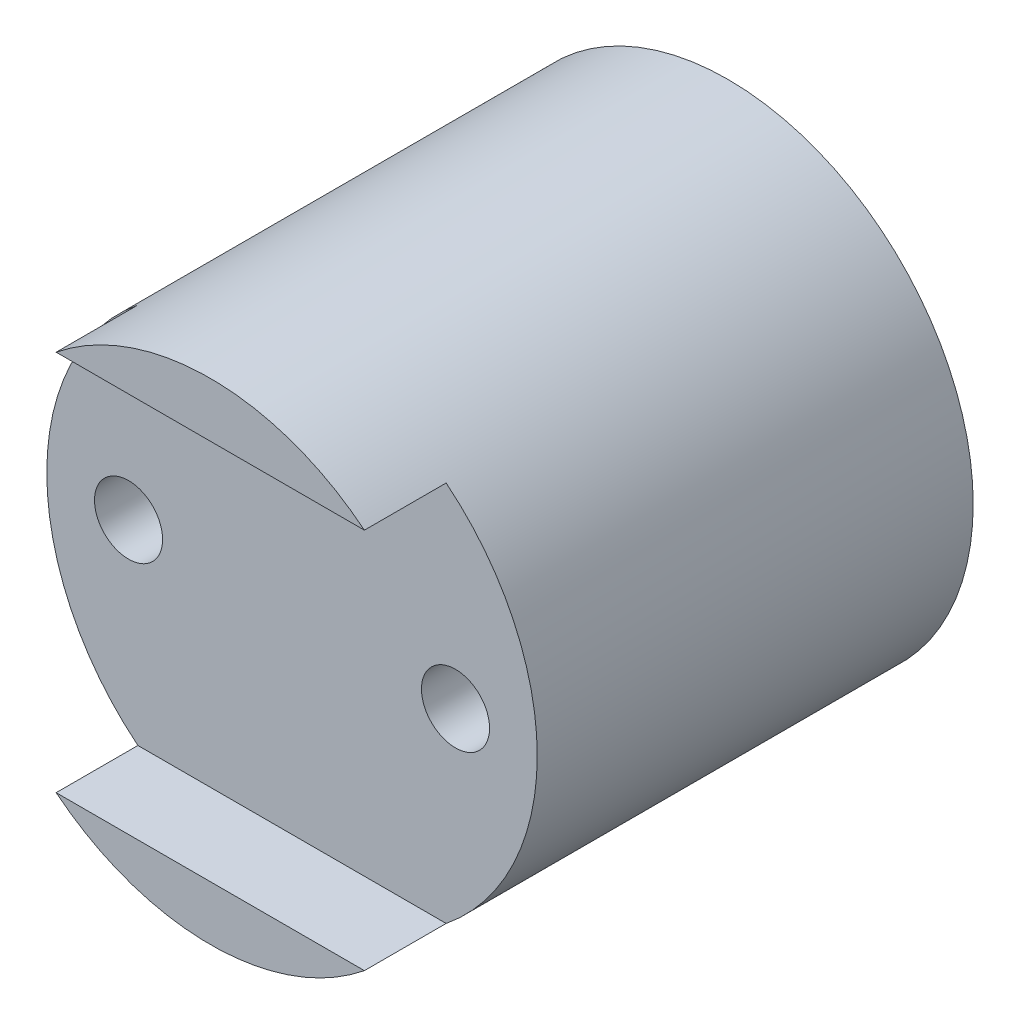
ISO-10303-21;
HEADER;
FILE_DESCRIPTION(('STEP AP214'),'2;1');
FILE_NAME('part.step','',(''),(''),'','','');
FILE_SCHEMA(('AUTOMOTIVE_DESIGN { 1 0 10303 214 1 1 1 1 }'));
ENDSEC;
DATA;
#1=APPLICATION_CONTEXT('core data for automotive mechanical design processes');
#2=APPLICATION_PROTOCOL_DEFINITION('international standard','automotive_design',2000,#1);
#3=PRODUCT_CONTEXT('',#1,'mechanical');
#4=PRODUCT('Part','Part','',(#3));
#5=PRODUCT_RELATED_PRODUCT_CATEGORY('part','',(#4));
#6=PRODUCT_DEFINITION_FORMATION('','',#4);
#7=PRODUCT_DEFINITION_CONTEXT('part definition',#1,'design');
#8=PRODUCT_DEFINITION('design','',#6,#7);
#9=PRODUCT_DEFINITION_SHAPE('','',#8);
#10=(LENGTH_UNIT() NAMED_UNIT(*) SI_UNIT(.MILLI.,.METRE.));
#11=(NAMED_UNIT(*) PLANE_ANGLE_UNIT() SI_UNIT($,.RADIAN.));
#12=(NAMED_UNIT(*) SI_UNIT($,.STERADIAN.) SOLID_ANGLE_UNIT());
#13=UNCERTAINTY_MEASURE_WITH_UNIT(LENGTH_MEASURE(1.E-05),#10,'distance_accuracy_value','');
#14=(GEOMETRIC_REPRESENTATION_CONTEXT(3) GLOBAL_UNCERTAINTY_ASSIGNED_CONTEXT((#13)) GLOBAL_UNIT_ASSIGNED_CONTEXT((#10,
#11,#12)) REPRESENTATION_CONTEXT('',''));
#15=CARTESIAN_POINT('',(0.,0.,0.));
#16=DIRECTION('',(0.,0.,1.));
#17=DIRECTION('',(1.,0.,0.));
#18=AXIS2_PLACEMENT_3D('',#15,#16,#17);
#19=CARTESIAN_POINT('',(0.,0.,19.));
#20=DIRECTION('',(0.,0.,-1.));
#21=DIRECTION('',(-1.,0.,0.));
#22=AXIS2_PLACEMENT_3D('',#19,#20,#21);
#23=CYLINDRICAL_SURFACE('',#22,9.);
#24=CARTESIAN_POINT('',(0.,0.,0.));
#25=DIRECTION('',(0.,0.,1.));
#26=DIRECTION('',(1.,0.,0.));
#27=AXIS2_PLACEMENT_3D('',#24,#25,#26);
#28=CIRCLE('',#27,9.);
#29=CARTESIAN_POINT('',(9.,0.,0.));
#30=VERTEX_POINT('',#29);
#31=EDGE_CURVE('E131',#30,#30,#28,.T.);
#32=ORIENTED_EDGE('',*,*,#31,.T.);
#33=EDGE_LOOP('',(#32));
#34=FACE_BOUND('',#33,.T.);
#35=DIRECTION('',(0.,0.,-1.));
#36=VECTOR('',#35,1.);
#37=CARTESIAN_POINT('',(5.65685424949238,-7.,19.));
#38=LINE('',#37,#36);
#39=CARTESIAN_POINT('',(5.65685424949238,-7.,19.));
#40=VERTEX_POINT('',#39);
#41=CARTESIAN_POINT('',(5.65685424949238,-7.,16.));
#42=VERTEX_POINT('',#41);
#43=EDGE_CURVE('E113',#40,#42,#38,.T.);
#44=ORIENTED_EDGE('',*,*,#43,.F.);
#45=CARTESIAN_POINT('',(0.,0.,19.));
#46=DIRECTION('',(0.,0.,1.));
#47=DIRECTION('',(1.,0.,0.));
#48=AXIS2_PLACEMENT_3D('',#45,#46,#47);
#49=CIRCLE('',#48,9.);
#50=CARTESIAN_POINT('',(-5.65685424949238,-7.,19.));
#51=VERTEX_POINT('',#50);
#52=EDGE_CURVE('E135',#51,#40,#49,.T.);
#53=ORIENTED_EDGE('',*,*,#52,.F.);
#54=DIRECTION('',(0.,0.,-1.));
#55=VECTOR('',#54,1.);
#56=CARTESIAN_POINT('',(-5.65685424949238,-7.,19.));
#57=LINE('',#56,#55);
#58=CARTESIAN_POINT('',(-5.65685424949238,-7.,16.));
#59=VERTEX_POINT('',#58);
#60=EDGE_CURVE('E108',#59,#51,#57,.F.);
#61=ORIENTED_EDGE('',*,*,#60,.F.);
#62=CARTESIAN_POINT('',(0.,0.,16.));
#63=DIRECTION('',(0.,0.,-1.));
#64=DIRECTION('',(-1.,0.,0.));
#65=AXIS2_PLACEMENT_3D('',#62,#63,#64);
#66=CIRCLE('',#65,9.);
#67=CARTESIAN_POINT('',(-5.65685424949238,7.,16.));
#68=VERTEX_POINT('',#67);
#69=EDGE_CURVE('E42',#59,#68,#66,.T.);
#70=ORIENTED_EDGE('',*,*,#69,.T.);
#71=DIRECTION('',(0.,0.,-1.));
#72=VECTOR('',#71,1.);
#73=CARTESIAN_POINT('',(-5.65685424949238,7.,19.));
#74=LINE('',#73,#72);
#75=CARTESIAN_POINT('',(-5.65685424949238,7.,19.));
#76=VERTEX_POINT('',#75);
#77=EDGE_CURVE('E102',#76,#68,#74,.T.);
#78=ORIENTED_EDGE('',*,*,#77,.F.);
#79=CARTESIAN_POINT('',(5.65685424949238,7.,19.));
#80=VERTEX_POINT('',#79);
#81=EDGE_CURVE('E106',#80,#76,#49,.T.);
#82=ORIENTED_EDGE('',*,*,#81,.F.);
#83=DIRECTION('',(0.,0.,-1.));
#84=VECTOR('',#83,1.);
#85=CARTESIAN_POINT('',(5.65685424949238,7.,19.));
#86=LINE('',#85,#84);
#87=CARTESIAN_POINT('',(5.65685424949238,7.,16.));
#88=VERTEX_POINT('',#87);
#89=EDGE_CURVE('E53',#88,#80,#86,.F.);
#90=ORIENTED_EDGE('',*,*,#89,.F.);
#91=EDGE_CURVE('E11',#88,#42,#66,.T.);
#92=ORIENTED_EDGE('',*,*,#91,.T.);
#93=EDGE_LOOP('',(#44,#53,#61,#70,#78,#82,#90,#92));
#94=FACE_BOUND('',#93,.T.);
#95=ADVANCED_FACE('F39',(#34,#94),#23,.T.);
#96=CARTESIAN_POINT('',(0.,0.,19.));
#97=DIRECTION('',(0.,0.,1.));
#98=DIRECTION('',(1.,0.,0.));
#99=AXIS2_PLACEMENT_3D('',#96,#97,#98);
#100=PLANE('',#99);
#101=ORIENTED_EDGE('',*,*,#52,.T.);
#102=DIRECTION('',(-1.,0.,0.));
#103=VECTOR('',#102,1.);
#104=CARTESIAN_POINT('',(0.,-7.,19.));
#105=LINE('',#104,#103);
#106=EDGE_CURVE('E141',#40,#51,#105,.T.);
#107=ORIENTED_EDGE('',*,*,#106,.T.);
#108=EDGE_LOOP('',(#101,#107));
#109=FACE_BOUND('',#108,.T.);
#110=ADVANCED_FACE('F180',(#109),#100,.T.);
#111=ORIENTED_EDGE('',*,*,#81,.T.);
#112=DIRECTION('',(1.,0.,0.));
#113=VECTOR('',#112,1.);
#114=CARTESIAN_POINT('',(0.,7.,19.));
#115=LINE('',#114,#113);
#116=EDGE_CURVE('E140',#76,#80,#115,.T.);
#117=ORIENTED_EDGE('',*,*,#116,.T.);
#118=EDGE_LOOP('',(#111,#117));
#119=FACE_BOUND('',#118,.T.);
#120=ADVANCED_FACE('F186',(#119),#100,.T.);
#121=CARTESIAN_POINT('',(0.,0.,12.));
#122=DIRECTION('',(0.,0.,-1.));
#123=DIRECTION('',(-1.,0.,0.));
#124=AXIS2_PLACEMENT_3D('',#121,#122,#123);
#125=CYLINDRICAL_SURFACE('',#124,4.);
#126=CARTESIAN_POINT('',(0.,0.,12.));
#127=DIRECTION('',(0.,0.,1.));
#128=DIRECTION('',(1.,0.,0.));
#129=AXIS2_PLACEMENT_3D('',#126,#127,#128);
#130=CIRCLE('',#129,4.);
#131=CARTESIAN_POINT('',(3.2,2.4,12.));
#132=VERTEX_POINT('',#131);
#133=CARTESIAN_POINT('',(3.2,-2.4,12.));
#134=VERTEX_POINT('',#133);
#135=EDGE_CURVE('E129',#132,#134,#130,.T.);
#136=ORIENTED_EDGE('',*,*,#135,.T.);
#137=DIRECTION('',(0.,0.,-1.));
#138=VECTOR('',#137,1.);
#139=CARTESIAN_POINT('',(3.2,-2.4,12.));
#140=LINE('',#139,#138);
#141=CARTESIAN_POINT('',(3.2,-2.4,0.));
#142=VERTEX_POINT('',#141);
#143=EDGE_CURVE('E61',#134,#142,#140,.T.);
#144=ORIENTED_EDGE('',*,*,#143,.T.);
#145=CARTESIAN_POINT('',(0.,0.,0.));
#146=DIRECTION('',(0.,0.,1.));
#147=DIRECTION('',(1.,0.,0.));
#148=AXIS2_PLACEMENT_3D('',#145,#146,#147);
#149=CIRCLE('',#148,4.);
#150=CARTESIAN_POINT('',(3.2,2.4,0.));
#151=VERTEX_POINT('',#150);
#152=EDGE_CURVE('E128',#151,#142,#149,.T.);
#153=ORIENTED_EDGE('',*,*,#152,.F.);
#154=DIRECTION('',(0.,0.,-1.));
#155=VECTOR('',#154,1.);
#156=CARTESIAN_POINT('',(3.2,2.4,12.));
#157=LINE('',#156,#155);
#158=EDGE_CURVE('E124',#151,#132,#157,.F.);
#159=ORIENTED_EDGE('',*,*,#158,.T.);
#160=EDGE_LOOP('',(#136,#144,#153,#159));
#161=FACE_BOUND('',#160,.T.);
#162=ADVANCED_FACE('F203',(#161),#125,.F.);
#163=CARTESIAN_POINT('',(0.,0.,12.));
#164=DIRECTION('',(0.,0.,1.));
#165=DIRECTION('',(1.,0.,0.));
#166=AXIS2_PLACEMENT_3D('',#163,#164,#165);
#167=PLANE('',#166);
#168=CARTESIAN_POINT('',(0.,0.,12.));
#169=DIRECTION('',(0.,0.,1.));
#170=DIRECTION('',(1.,0.,0.));
#171=AXIS2_PLACEMENT_3D('',#168,#169,#170);
#172=CIRCLE('',#171,3.);
#173=CARTESIAN_POINT('',(3.,0.,12.));
#174=VERTEX_POINT('',#173);
#175=EDGE_CURVE('E115',#174,#174,#172,.T.);
#176=ORIENTED_EDGE('',*,*,#175,.T.);
#177=EDGE_LOOP('',(#176));
#178=FACE_BOUND('',#177,.T.);
#179=DIRECTION('',(0.,1.,0.));
#180=VECTOR('',#179,1.);
#181=CARTESIAN_POINT('',(3.2,0.,12.));
#182=LINE('',#181,#180);
#183=EDGE_CURVE('E134',#134,#132,#182,.T.);
#184=ORIENTED_EDGE('',*,*,#183,.F.);
#185=ORIENTED_EDGE('',*,*,#135,.F.);
#186=EDGE_LOOP('',(#184,#185));
#187=FACE_BOUND('',#186,.T.);
#188=ADVANCED_FACE('F193',(#178,#187),#167,.F.);
#189=CARTESIAN_POINT('',(0.,0.,0.));
#190=DIRECTION('',(0.,0.,1.));
#191=DIRECTION('',(1.,0.,0.));
#192=AXIS2_PLACEMENT_3D('',#189,#190,#191);
#193=PLANE('',#192);
#194=ORIENTED_EDGE('',*,*,#152,.T.);
#195=DIRECTION('',(0.,-1.,0.));
#196=VECTOR('',#195,1.);
#197=CARTESIAN_POINT('',(3.2,-4.5,0.));
#198=LINE('',#197,#196);
#199=EDGE_CURVE('E119',#151,#142,#198,.T.);
#200=ORIENTED_EDGE('',*,*,#199,.F.);
#201=EDGE_LOOP('',(#194,#200));
#202=FACE_BOUND('',#201,.T.);
#203=ORIENTED_EDGE('',*,*,#31,.F.);
#204=EDGE_LOOP('',(#203));
#205=FACE_BOUND('',#204,.T.);
#206=ADVANCED_FACE('F190',(#202,#205),#193,.F.);
#207=CARTESIAN_POINT('',(3.2,-4.5,12.));
#208=DIRECTION('',(1.,0.,0.));
#209=DIRECTION('',(0.,0.,-1.));
#210=AXIS2_PLACEMENT_3D('',#207,#208,#209);
#211=PLANE('',#210);
#212=ORIENTED_EDGE('',*,*,#143,.F.);
#213=ORIENTED_EDGE('',*,*,#183,.T.);
#214=ORIENTED_EDGE('',*,*,#158,.F.);
#215=ORIENTED_EDGE('',*,*,#199,.T.);
#216=EDGE_LOOP('',(#212,#213,#214,#215));
#217=FACE_BOUND('',#216,.T.);
#218=ADVANCED_FACE('F192',(#217),#211,.F.);
#219=CARTESIAN_POINT('',(0.,0.,15.));
#220=DIRECTION('',(0.,0.,-1.));
#221=DIRECTION('',(-1.,0.,0.));
#222=AXIS2_PLACEMENT_3D('',#219,#220,#221);
#223=CYLINDRICAL_SURFACE('',#222,3.);
#224=CARTESIAN_POINT('',(0.,0.,15.));
#225=DIRECTION('',(0.,0.,1.));
#226=DIRECTION('',(1.,0.,0.));
#227=AXIS2_PLACEMENT_3D('',#224,#225,#226);
#228=CIRCLE('',#227,3.);
#229=CARTESIAN_POINT('',(3.,0.,15.));
#230=VERTEX_POINT('',#229);
#231=EDGE_CURVE('E116',#230,#230,#228,.T.);
#232=ORIENTED_EDGE('',*,*,#231,.T.);
#233=EDGE_LOOP('',(#232));
#234=FACE_BOUND('',#233,.T.);
#235=ORIENTED_EDGE('',*,*,#175,.F.);
#236=EDGE_LOOP('',(#235));
#237=FACE_BOUND('',#236,.T.);
#238=ADVANCED_FACE('F199',(#234,#237),#223,.F.);
#239=CARTESIAN_POINT('',(0.,0.,15.));
#240=DIRECTION('',(0.,0.,1.));
#241=DIRECTION('',(1.,0.,0.));
#242=AXIS2_PLACEMENT_3D('',#239,#240,#241);
#243=PLANE('',#242);
#244=ORIENTED_EDGE('',*,*,#231,.F.);
#245=EDGE_LOOP('',(#244));
#246=FACE_BOUND('',#245,.T.);
#247=ADVANCED_FACE('F210',(#246),#243,.F.);
#248=CARTESIAN_POINT('',(0.,0.,16.));
#249=DIRECTION('',(0.,0.,-1.));
#250=DIRECTION('',(-1.,0.,0.));
#251=AXIS2_PLACEMENT_3D('',#248,#249,#250);
#252=PLANE('',#251);
#253=CARTESIAN_POINT('',(-6.,0.,16.));
#254=DIRECTION('',(0.,0.,1.));
#255=DIRECTION('',(1.,0.,0.));
#256=AXIS2_PLACEMENT_3D('',#253,#254,#255);
#257=CIRCLE('',#256,1.25);
#258=CARTESIAN_POINT('',(-4.75,0.,16.));
#259=VERTEX_POINT('',#258);
#260=EDGE_CURVE('E149',#259,#259,#257,.T.);
#261=ORIENTED_EDGE('',*,*,#260,.F.);
#262=EDGE_LOOP('',(#261));
#263=FACE_BOUND('',#262,.T.);
#264=CARTESIAN_POINT('',(6.,0.,16.));
#265=DIRECTION('',(0.,0.,1.));
#266=DIRECTION('',(1.,0.,0.));
#267=AXIS2_PLACEMENT_3D('',#264,#265,#266);
#268=CIRCLE('',#267,1.25);
#269=CARTESIAN_POINT('',(7.25,0.,16.));
#270=VERTEX_POINT('',#269);
#271=EDGE_CURVE('E154',#270,#270,#268,.T.);
#272=ORIENTED_EDGE('',*,*,#271,.F.);
#273=EDGE_LOOP('',(#272));
#274=FACE_BOUND('',#273,.T.);
#275=DIRECTION('',(-1.,0.,0.));
#276=VECTOR('',#275,1.);
#277=CARTESIAN_POINT('',(-11.,7.,16.));
#278=LINE('',#277,#276);
#279=EDGE_CURVE('E94',#88,#68,#278,.T.);
#280=ORIENTED_EDGE('',*,*,#279,.T.);
#281=ORIENTED_EDGE('',*,*,#69,.F.);
#282=DIRECTION('',(1.,0.,0.));
#283=VECTOR('',#282,1.);
#284=CARTESIAN_POINT('',(-11.,-7.,16.));
#285=LINE('',#284,#283);
#286=EDGE_CURVE('E97',#59,#42,#285,.T.);
#287=ORIENTED_EDGE('',*,*,#286,.T.);
#288=ORIENTED_EDGE('',*,*,#91,.F.);
#289=EDGE_LOOP('',(#280,#281,#287,#288));
#290=FACE_BOUND('',#289,.T.);
#291=ADVANCED_FACE('F93',(#263,#274,#290),#252,.F.);
#292=CARTESIAN_POINT('',(-11.,-7.,19.));
#293=DIRECTION('',(0.,1.,0.));
#294=DIRECTION('',(0.,0.,1.));
#295=AXIS2_PLACEMENT_3D('',#292,#293,#294);
#296=PLANE('',#295);
#297=ORIENTED_EDGE('',*,*,#43,.T.);
#298=ORIENTED_EDGE('',*,*,#286,.F.);
#299=ORIENTED_EDGE('',*,*,#60,.T.);
#300=ORIENTED_EDGE('',*,*,#106,.F.);
#301=EDGE_LOOP('',(#297,#298,#299,#300));
#302=FACE_BOUND('',#301,.T.);
#303=ADVANCED_FACE('F148',(#302),#296,.T.);
#304=CARTESIAN_POINT('',(-11.,7.,19.));
#305=DIRECTION('',(0.,-1.,0.));
#306=DIRECTION('',(0.,0.,-1.));
#307=AXIS2_PLACEMENT_3D('',#304,#305,#306);
#308=PLANE('',#307);
#309=ORIENTED_EDGE('',*,*,#77,.T.);
#310=ORIENTED_EDGE('',*,*,#279,.F.);
#311=ORIENTED_EDGE('',*,*,#89,.T.);
#312=ORIENTED_EDGE('',*,*,#116,.F.);
#313=EDGE_LOOP('',(#309,#310,#311,#312));
#314=FACE_BOUND('',#313,.T.);
#315=ADVANCED_FACE('F100',(#314),#308,.T.);
#316=CARTESIAN_POINT('',(6.,0.,16.));
#317=DIRECTION('',(0.,0.,-1.));
#318=DIRECTION('',(-1.,0.,0.));
#319=AXIS2_PLACEMENT_3D('',#316,#317,#318);
#320=CYLINDRICAL_SURFACE('',#319,1.25);
#321=ORIENTED_EDGE('',*,*,#271,.T.);
#322=EDGE_LOOP('',(#321));
#323=FACE_BOUND('',#322,.T.);
#324=CARTESIAN_POINT('',(6.,0.,10.));
#325=DIRECTION('',(0.,0.,1.));
#326=DIRECTION('',(1.,0.,0.));
#327=AXIS2_PLACEMENT_3D('',#324,#325,#326);
#328=CIRCLE('',#327,1.25);
#329=CARTESIAN_POINT('',(7.25,0.,10.));
#330=VERTEX_POINT('',#329);
#331=EDGE_CURVE('E157',#330,#330,#328,.T.);
#332=ORIENTED_EDGE('',*,*,#331,.F.);
#333=EDGE_LOOP('',(#332));
#334=FACE_BOUND('',#333,.T.);
#335=ADVANCED_FACE('F175',(#323,#334),#320,.F.);
#336=CARTESIAN_POINT('',(6.,0.,10.));
#337=DIRECTION('',(0.,0.,1.));
#338=DIRECTION('',(1.,0.,0.));
#339=AXIS2_PLACEMENT_3D('',#336,#337,#338);
#340=PLANE('',#339);
#341=ORIENTED_EDGE('',*,*,#331,.T.);
#342=EDGE_LOOP('',(#341));
#343=FACE_BOUND('',#342,.T.);
#344=ADVANCED_FACE('F167',(#343),#340,.T.);
#345=CARTESIAN_POINT('',(-6.,0.,16.));
#346=DIRECTION('',(0.,0.,-1.));
#347=DIRECTION('',(-1.,0.,0.));
#348=AXIS2_PLACEMENT_3D('',#345,#346,#347);
#349=CYLINDRICAL_SURFACE('',#348,1.25);
#350=ORIENTED_EDGE('',*,*,#260,.T.);
#351=EDGE_LOOP('',(#350));
#352=FACE_BOUND('',#351,.T.);
#353=CARTESIAN_POINT('',(-6.,0.,10.));
#354=DIRECTION('',(0.,0.,1.));
#355=DIRECTION('',(1.,0.,0.));
#356=AXIS2_PLACEMENT_3D('',#353,#354,#355);
#357=CIRCLE('',#356,1.25);
#358=CARTESIAN_POINT('',(-4.75,0.,10.));
#359=VERTEX_POINT('',#358);
#360=EDGE_CURVE('E151',#359,#359,#357,.T.);
#361=ORIENTED_EDGE('',*,*,#360,.F.);
#362=EDGE_LOOP('',(#361));
#363=FACE_BOUND('',#362,.T.);
#364=ADVANCED_FACE('F165',(#352,#363),#349,.F.);
#365=CARTESIAN_POINT('',(-6.,0.,10.));
#366=DIRECTION('',(0.,0.,1.));
#367=DIRECTION('',(1.,0.,0.));
#368=AXIS2_PLACEMENT_3D('',#365,#366,#367);
#369=PLANE('',#368);
#370=ORIENTED_EDGE('',*,*,#360,.T.);
#371=EDGE_LOOP('',(#370));
#372=FACE_BOUND('',#371,.T.);
#373=ADVANCED_FACE('F163',(#372),#369,.T.);
#374=CLOSED_SHELL('',(#95,#110,#120,#162,#188,#206,#218,#238,#247,#291,#303,#315,#335,#344,#364,#373));
#375=MANIFOLD_SOLID_BREP('B2',#374);
#376=ADVANCED_BREP_SHAPE_REPRESENTATION('',(#18,#375),#14);
#377=SHAPE_DEFINITION_REPRESENTATION(#9,#376);
ENDSEC;
END-ISO-10303-21;
